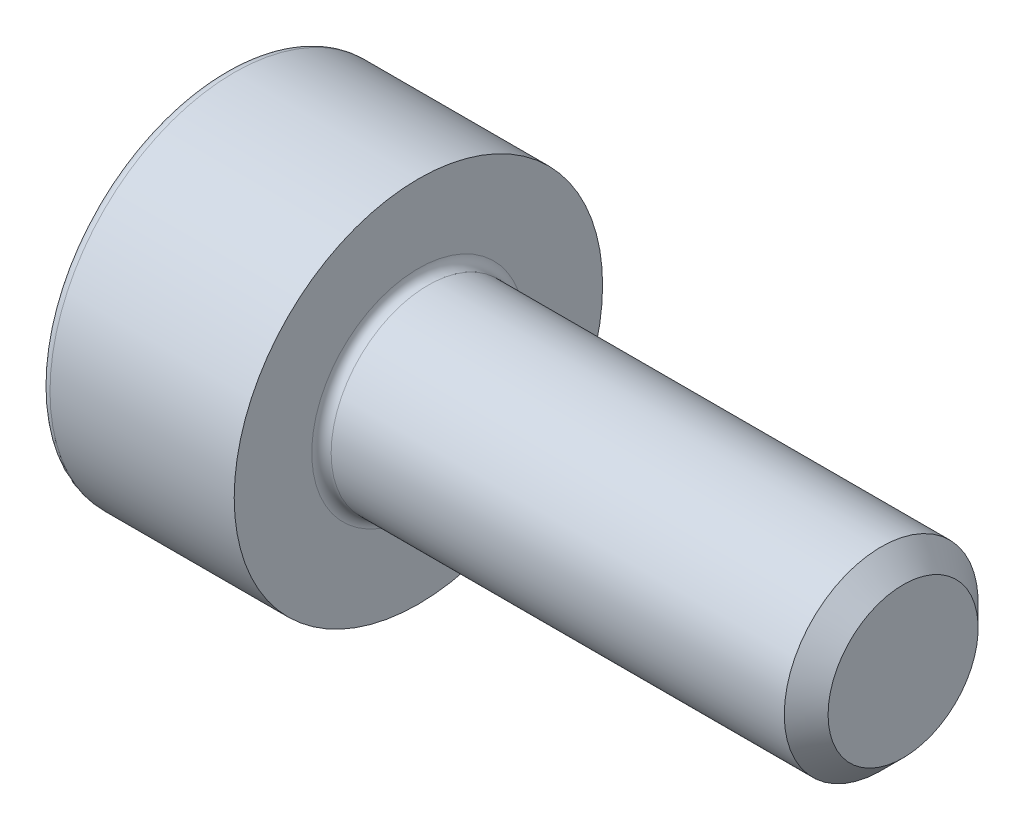
ISO-10303-21;
HEADER;
FILE_DESCRIPTION(('STEP AP214'),'2;1');
FILE_NAME('part.step','',(''),(''),'','','');
FILE_SCHEMA(('AUTOMOTIVE_DESIGN { 1 0 10303 214 1 1 1 1 }'));
ENDSEC;
DATA;
#1=APPLICATION_CONTEXT('core data for automotive mechanical design processes');
#2=APPLICATION_PROTOCOL_DEFINITION('international standard','automotive_design',2000,#1);
#3=PRODUCT_CONTEXT('',#1,'mechanical');
#4=PRODUCT('Part','Part','',(#3));
#5=PRODUCT_RELATED_PRODUCT_CATEGORY('part','',(#4));
#6=PRODUCT_DEFINITION_FORMATION('','',#4);
#7=PRODUCT_DEFINITION_CONTEXT('part definition',#1,'design');
#8=PRODUCT_DEFINITION('design','',#6,#7);
#9=PRODUCT_DEFINITION_SHAPE('','',#8);
#10=(LENGTH_UNIT() NAMED_UNIT(*) SI_UNIT(.MILLI.,.METRE.));
#11=(NAMED_UNIT(*) PLANE_ANGLE_UNIT() SI_UNIT($,.RADIAN.));
#12=(NAMED_UNIT(*) SI_UNIT($,.STERADIAN.) SOLID_ANGLE_UNIT());
#13=UNCERTAINTY_MEASURE_WITH_UNIT(LENGTH_MEASURE(1.E-05),#10,'distance_accuracy_value','');
#14=(GEOMETRIC_REPRESENTATION_CONTEXT(3) GLOBAL_UNCERTAINTY_ASSIGNED_CONTEXT((#13)) GLOBAL_UNIT_ASSIGNED_CONTEXT((#10,
#11,#12)) REPRESENTATION_CONTEXT('',''));
#15=CARTESIAN_POINT('',(0.,0.,0.));
#16=DIRECTION('',(0.,0.,1.));
#17=DIRECTION('',(1.,0.,0.));
#18=AXIS2_PLACEMENT_3D('',#15,#16,#17);
#19=CARTESIAN_POINT('',(0.,0.,0.));
#20=DIRECTION('',(-1.,0.,0.));
#21=DIRECTION('',(0.,0.,1.));
#22=AXIS2_PLACEMENT_3D('',#19,#20,#21);
#23=PLANE('',#22);
#24=DIRECTION('',(0.,-0.5,0.86602540378444));
#25=VECTOR('',#24,1.);
#26=CARTESIAN_POINT('',(0.,0.892006165897969,0.));
#27=LINE('',#26,#25);
#28=CARTESIAN_POINT('',(0.,0.892006165897969,0.));
#29=VERTEX_POINT('',#28);
#30=CARTESIAN_POINT('',(0.,0.446003082948984,0.7725));
#31=VERTEX_POINT('',#30);
#32=EDGE_CURVE('E253',#29,#31,#27,.T.);
#33=ORIENTED_EDGE('',*,*,#32,.T.);
#34=DIRECTION('',(0.,1.,0.));
#35=VECTOR('',#34,1.);
#36=CARTESIAN_POINT('',(0.,-0.446003082948988,0.7725));
#37=LINE('',#36,#35);
#38=CARTESIAN_POINT('',(0.,-0.446003082948988,0.7725));
#39=VERTEX_POINT('',#38);
#40=EDGE_CURVE('E108',#39,#31,#37,.T.);
#41=ORIENTED_EDGE('',*,*,#40,.F.);
#42=DIRECTION('',(0.,-0.5,-0.866025403784438));
#43=VECTOR('',#42,1.);
#44=CARTESIAN_POINT('',(0.,-0.446003082948988,0.7725));
#45=LINE('',#44,#43);
#46=CARTESIAN_POINT('',(0.,-0.892006165897974,0.));
#47=VERTEX_POINT('',#46);
#48=EDGE_CURVE('E256',#39,#47,#45,.T.);
#49=ORIENTED_EDGE('',*,*,#48,.T.);
#50=DIRECTION('',(0.,0.5,-0.86602540378444));
#51=VECTOR('',#50,1.);
#52=CARTESIAN_POINT('',(0.,-0.892006165897974,0.));
#53=LINE('',#52,#51);
#54=CARTESIAN_POINT('',(0.,-0.44600308294899,-0.7725));
#55=VERTEX_POINT('',#54);
#56=EDGE_CURVE('E259',#47,#55,#53,.T.);
#57=ORIENTED_EDGE('',*,*,#56,.T.);
#58=DIRECTION('',(0.,-1.,0.));
#59=VECTOR('',#58,1.);
#60=CARTESIAN_POINT('',(0.,0.446003082948982,-0.7725));
#61=LINE('',#60,#59);
#62=CARTESIAN_POINT('',(0.,0.446003082948982,-0.7725));
#63=VERTEX_POINT('',#62);
#64=EDGE_CURVE('E262',#63,#55,#61,.T.);
#65=ORIENTED_EDGE('',*,*,#64,.F.);
#66=DIRECTION('',(0.,-0.5,-0.866025403784438));
#67=VECTOR('',#66,1.);
#68=CARTESIAN_POINT('',(0.,0.892006165897969,0.));
#69=LINE('',#68,#67);
#70=EDGE_CURVE('E103',#29,#63,#69,.T.);
#71=ORIENTED_EDGE('',*,*,#70,.F.);
#72=EDGE_LOOP('',(#33,#41,#49,#57,#65,#71));
#73=FACE_BOUND('',#72,.T.);
#74=CARTESIAN_POINT('',(0.,0.,0.));
#75=DIRECTION('',(-1.,0.,0.));
#76=DIRECTION('',(0.,0.,1.));
#77=AXIS2_PLACEMENT_3D('',#74,#75,#76);
#78=CIRCLE('',#77,1.8);
#79=CARTESIAN_POINT('',(0.,0.,1.8));
#80=VERTEX_POINT('',#79);
#81=EDGE_CURVE('E24',#80,#80,#78,.T.);
#82=ORIENTED_EDGE('',*,*,#81,.T.);
#83=EDGE_LOOP('',(#82));
#84=FACE_BOUND('',#83,.T.);
#85=ADVANCED_FACE('F16',(#73,#84),#23,.T.);
#86=CARTESIAN_POINT('',(-31.75,0.,0.));
#87=DIRECTION('',(-1.,0.,0.));
#88=DIRECTION('',(0.,0.,1.));
#89=AXIS2_PLACEMENT_3D('',#86,#87,#88);
#90=CYLINDRICAL_SURFACE('',#89,1.9);
#91=CARTESIAN_POINT('',(0.100000000000003,0.,0.));
#92=DIRECTION('',(-1.,0.,0.));
#93=DIRECTION('',(0.,0.,1.));
#94=AXIS2_PLACEMENT_3D('',#91,#92,#93);
#95=CIRCLE('',#94,1.9);
#96=CARTESIAN_POINT('',(0.100000000000003,0.,1.9));
#97=VERTEX_POINT('',#96);
#98=EDGE_CURVE('E11',#97,#97,#95,.F.);
#99=ORIENTED_EDGE('',*,*,#98,.T.);
#100=EDGE_LOOP('',(#99));
#101=FACE_BOUND('',#100,.T.);
#102=CARTESIAN_POINT('',(2.,0.,0.));
#103=DIRECTION('',(-1.,0.,0.));
#104=DIRECTION('',(0.,0.,1.));
#105=AXIS2_PLACEMENT_3D('',#102,#103,#104);
#106=CIRCLE('',#105,1.9);
#107=CARTESIAN_POINT('',(2.,0.,1.9));
#108=VERTEX_POINT('',#107);
#109=EDGE_CURVE('E126',#108,#108,#106,.T.);
#110=ORIENTED_EDGE('',*,*,#109,.T.);
#111=EDGE_LOOP('',(#110));
#112=FACE_BOUND('',#111,.T.);
#113=ADVANCED_FACE('F152',(#101,#112),#90,.T.);
#114=CARTESIAN_POINT('',(2.,1.9,0.));
#115=DIRECTION('',(1.,0.,0.));
#116=DIRECTION('',(0.,0.,-1.));
#117=AXIS2_PLACEMENT_3D('',#114,#115,#116);
#118=PLANE('',#117);
#119=CARTESIAN_POINT('',(2.,0.,0.));
#120=DIRECTION('',(1.,0.,0.));
#121=DIRECTION('',(0.,0.,-1.));
#122=AXIS2_PLACEMENT_3D('',#119,#120,#121);
#123=CIRCLE('',#122,1.1);
#124=CARTESIAN_POINT('',(2.,0.,-1.1));
#125=VERTEX_POINT('',#124);
#126=EDGE_CURVE('E129',#125,#125,#123,.F.);
#127=ORIENTED_EDGE('',*,*,#126,.T.);
#128=EDGE_LOOP('',(#127));
#129=FACE_BOUND('',#128,.T.);
#130=ORIENTED_EDGE('',*,*,#109,.F.);
#131=EDGE_LOOP('',(#130));
#132=FACE_BOUND('',#131,.T.);
#133=ADVANCED_FACE('F159',(#129,#132),#118,.T.);
#134=CARTESIAN_POINT('',(-31.75,0.,0.));
#135=DIRECTION('',(-1.,0.,0.));
#136=DIRECTION('',(0.,0.,1.));
#137=AXIS2_PLACEMENT_3D('',#134,#135,#136);
#138=CYLINDRICAL_SURFACE('',#137,1.);
#139=CARTESIAN_POINT('',(2.1,0.,0.));
#140=DIRECTION('',(1.,0.,0.));
#141=DIRECTION('',(0.,0.,-1.));
#142=AXIS2_PLACEMENT_3D('',#139,#140,#141);
#143=CIRCLE('',#142,1.);
#144=CARTESIAN_POINT('',(2.1,0.,-1.));
#145=VERTEX_POINT('',#144);
#146=EDGE_CURVE('E132',#145,#145,#143,.T.);
#147=ORIENTED_EDGE('',*,*,#146,.T.);
#148=EDGE_LOOP('',(#147));
#149=FACE_BOUND('',#148,.T.);
#150=CARTESIAN_POINT('',(6.774,0.,0.));
#151=DIRECTION('',(-1.,0.,0.));
#152=DIRECTION('',(0.,0.,1.));
#153=AXIS2_PLACEMENT_3D('',#150,#151,#152);
#154=CIRCLE('',#153,1.);
#155=CARTESIAN_POINT('',(6.774,0.,1.));
#156=VERTEX_POINT('',#155);
#157=EDGE_CURVE('E123',#156,#156,#154,.T.);
#158=ORIENTED_EDGE('',*,*,#157,.T.);
#159=EDGE_LOOP('',(#158));
#160=FACE_BOUND('',#159,.T.);
#161=ADVANCED_FACE('F165',(#149,#160),#138,.T.);
#162=CARTESIAN_POINT('',(7.,0.,0.));
#163=DIRECTION('',(-1.,0.,0.));
#164=DIRECTION('',(0.,0.,1.));
#165=AXIS2_PLACEMENT_3D('',#162,#163,#164);
#166=CONICAL_SURFACE('',#165,0.774,0.785398163397475);
#167=ORIENTED_EDGE('',*,*,#157,.F.);
#168=EDGE_LOOP('',(#167));
#169=FACE_BOUND('',#168,.T.);
#170=CARTESIAN_POINT('',(7.,0.,0.));
#171=DIRECTION('',(-1.,0.,0.));
#172=DIRECTION('',(0.,0.,1.));
#173=AXIS2_PLACEMENT_3D('',#170,#171,#172);
#174=CIRCLE('',#173,0.774);
#175=CARTESIAN_POINT('',(7.,0.,0.774));
#176=VERTEX_POINT('',#175);
#177=EDGE_CURVE('E119',#176,#176,#174,.T.);
#178=ORIENTED_EDGE('',*,*,#177,.T.);
#179=EDGE_LOOP('',(#178));
#180=FACE_BOUND('',#179,.T.);
#181=ADVANCED_FACE('F169',(#169,#180),#166,.T.);
#182=CARTESIAN_POINT('',(7.,0.774,0.));
#183=DIRECTION('',(1.,0.,0.));
#184=DIRECTION('',(0.,0.,-1.));
#185=AXIS2_PLACEMENT_3D('',#182,#183,#184);
#186=PLANE('',#185);
#187=ORIENTED_EDGE('',*,*,#177,.F.);
#188=EDGE_LOOP('',(#187));
#189=FACE_BOUND('',#188,.T.);
#190=ADVANCED_FACE('F148',(#189),#186,.T.);
#191=CARTESIAN_POINT('',(2.1,0.,0.));
#192=DIRECTION('',(1.,0.,0.));
#193=DIRECTION('',(0.,0.,-1.));
#194=AXIS2_PLACEMENT_3D('',#191,#192,#193);
#195=TOROIDAL_SURFACE('',#194,1.1,0.1);
#196=ORIENTED_EDGE('',*,*,#146,.F.);
#197=EDGE_LOOP('',(#196));
#198=FACE_BOUND('',#197,.T.);
#199=ORIENTED_EDGE('',*,*,#126,.F.);
#200=EDGE_LOOP('',(#199));
#201=FACE_BOUND('',#200,.T.);
#202=ADVANCED_FACE('F139',(#198,#201),#195,.F.);
#203=CARTESIAN_POINT('',(0.100000000000003,0.,0.));
#204=DIRECTION('',(-1.,0.,0.));
#205=DIRECTION('',(0.,0.,1.));
#206=AXIS2_PLACEMENT_3D('',#203,#204,#205);
#207=TOROIDAL_SURFACE('',#206,1.8,0.1);
#208=ORIENTED_EDGE('',*,*,#98,.F.);
#209=EDGE_LOOP('',(#208));
#210=FACE_BOUND('',#209,.T.);
#211=ORIENTED_EDGE('',*,*,#81,.F.);
#212=EDGE_LOOP('',(#211));
#213=FACE_BOUND('',#212,.T.);
#214=ADVANCED_FACE('F18',(#210,#213),#207,.T.);
#215=CARTESIAN_POINT('',(1.,0.892006165897969,0.));
#216=DIRECTION('',(0.,-0.86602540378444,-0.5));
#217=DIRECTION('',(0.,0.5,-0.86602540378444));
#218=AXIS2_PLACEMENT_3D('',#215,#216,#217);
#219=PLANE('',#218);
#220=ORIENTED_EDGE('',*,*,#32,.F.);
#221=DIRECTION('',(-1.,0.,0.));
#222=VECTOR('',#221,1.);
#223=CARTESIAN_POINT('',(1.,0.892006165897969,0.));
#224=LINE('',#223,#222);
#225=CARTESIAN_POINT('',(1.,0.892006165897969,0.));
#226=VERTEX_POINT('',#225);
#227=EDGE_CURVE('E252',#226,#29,#224,.T.);
#228=ORIENTED_EDGE('',*,*,#227,.F.);
#229=DIRECTION('',(0.,-0.5,0.86602540378444));
#230=VECTOR('',#229,1.);
#231=CARTESIAN_POINT('',(1.,0.892006165897969,0.));
#232=LINE('',#231,#230);
#233=CARTESIAN_POINT('',(1.,0.66900462442348,0.38625));
#234=VERTEX_POINT('',#233);
#235=EDGE_CURVE('E31',#226,#234,#232,.T.);
#236=ORIENTED_EDGE('',*,*,#235,.T.);
#237=CARTESIAN_POINT('',(1.,0.446003082948984,0.7725));
#238=VERTEX_POINT('',#237);
#239=EDGE_CURVE('E89',#234,#238,#232,.T.);
#240=ORIENTED_EDGE('',*,*,#239,.T.);
#241=DIRECTION('',(-1.,0.,0.));
#242=VECTOR('',#241,1.);
#243=CARTESIAN_POINT('',(1.,0.446003082948984,0.7725));
#244=LINE('',#243,#242);
#245=EDGE_CURVE('E101',#238,#31,#244,.T.);
#246=ORIENTED_EDGE('',*,*,#245,.T.);
#247=EDGE_LOOP('',(#220,#228,#236,#240,#246));
#248=FACE_BOUND('',#247,.T.);
#249=ADVANCED_FACE('F100',(#248),#219,.T.);
#250=CARTESIAN_POINT('',(1.,-0.446003082948988,0.7725));
#251=DIRECTION('',(0.,0.,1.));
#252=DIRECTION('',(0.,-1.,0.));
#253=AXIS2_PLACEMENT_3D('',#250,#251,#252);
#254=PLANE('',#253);
#255=ORIENTED_EDGE('',*,*,#40,.T.);
#256=ORIENTED_EDGE('',*,*,#245,.F.);
#257=DIRECTION('',(0.,1.,0.));
#258=VECTOR('',#257,1.);
#259=CARTESIAN_POINT('',(1.,-0.446003082948988,0.7725));
#260=LINE('',#259,#258);
#261=CARTESIAN_POINT('',(1.,0.,0.7725));
#262=VERTEX_POINT('',#261);
#263=EDGE_CURVE('E87',#262,#238,#260,.T.);
#264=ORIENTED_EDGE('',*,*,#263,.F.);
#265=CARTESIAN_POINT('',(1.,-0.446003082948988,0.7725));
#266=VERTEX_POINT('',#265);
#267=EDGE_CURVE('E97',#266,#262,#260,.T.);
#268=ORIENTED_EDGE('',*,*,#267,.F.);
#269=DIRECTION('',(-1.,0.,0.));
#270=VECTOR('',#269,1.);
#271=CARTESIAN_POINT('',(1.,-0.446003082948988,0.7725));
#272=LINE('',#271,#270);
#273=EDGE_CURVE('E110',#266,#39,#272,.T.);
#274=ORIENTED_EDGE('',*,*,#273,.T.);
#275=EDGE_LOOP('',(#255,#256,#264,#268,#274));
#276=FACE_BOUND('',#275,.T.);
#277=ADVANCED_FACE('F105',(#276),#254,.F.);
#278=CARTESIAN_POINT('',(1.,-0.446003082948988,0.7725));
#279=DIRECTION('',(0.,0.866025403784438,-0.5));
#280=DIRECTION('',(0.,0.5,0.866025403784438));
#281=AXIS2_PLACEMENT_3D('',#278,#279,#280);
#282=PLANE('',#281);
#283=ORIENTED_EDGE('',*,*,#48,.F.);
#284=ORIENTED_EDGE('',*,*,#273,.F.);
#285=DIRECTION('',(0.,-0.5,-0.866025403784438));
#286=VECTOR('',#285,1.);
#287=CARTESIAN_POINT('',(1.,-0.446003082948988,0.7725));
#288=LINE('',#287,#286);
#289=CARTESIAN_POINT('',(1.,-0.669004624423479,0.38625));
#290=VERTEX_POINT('',#289);
#291=EDGE_CURVE('E233',#266,#290,#288,.T.);
#292=ORIENTED_EDGE('',*,*,#291,.T.);
#293=CARTESIAN_POINT('',(1.,-0.892006165897974,0.));
#294=VERTEX_POINT('',#293);
#295=EDGE_CURVE('E235',#290,#294,#288,.T.);
#296=ORIENTED_EDGE('',*,*,#295,.T.);
#297=DIRECTION('',(-1.,0.,0.));
#298=VECTOR('',#297,1.);
#299=CARTESIAN_POINT('',(1.,-0.892006165897974,0.));
#300=LINE('',#299,#298);
#301=EDGE_CURVE('E115',#294,#47,#300,.T.);
#302=ORIENTED_EDGE('',*,*,#301,.T.);
#303=EDGE_LOOP('',(#283,#284,#292,#296,#302));
#304=FACE_BOUND('',#303,.T.);
#305=ADVANCED_FACE('F182',(#304),#282,.T.);
#306=CARTESIAN_POINT('',(1.,-0.892006165897974,0.));
#307=DIRECTION('',(0.,0.86602540378444,0.5));
#308=DIRECTION('',(0.,-0.5,0.86602540378444));
#309=AXIS2_PLACEMENT_3D('',#306,#307,#308);
#310=PLANE('',#309);
#311=ORIENTED_EDGE('',*,*,#56,.F.);
#312=ORIENTED_EDGE('',*,*,#301,.F.);
#313=DIRECTION('',(0.,0.5,-0.86602540378444));
#314=VECTOR('',#313,1.);
#315=CARTESIAN_POINT('',(1.,-0.892006165897974,0.));
#316=LINE('',#315,#314);
#317=CARTESIAN_POINT('',(1.,-0.669004624423483,-0.38625));
#318=VERTEX_POINT('',#317);
#319=EDGE_CURVE('E238',#294,#318,#316,.T.);
#320=ORIENTED_EDGE('',*,*,#319,.T.);
#321=CARTESIAN_POINT('',(1.,-0.44600308294899,-0.7725));
#322=VERTEX_POINT('',#321);
#323=EDGE_CURVE('E242',#318,#322,#316,.T.);
#324=ORIENTED_EDGE('',*,*,#323,.T.);
#325=DIRECTION('',(-1.,0.,0.));
#326=VECTOR('',#325,1.);
#327=CARTESIAN_POINT('',(1.,-0.44600308294899,-0.7725));
#328=LINE('',#327,#326);
#329=EDGE_CURVE('E271',#322,#55,#328,.T.);
#330=ORIENTED_EDGE('',*,*,#329,.T.);
#331=EDGE_LOOP('',(#311,#312,#320,#324,#330));
#332=FACE_BOUND('',#331,.T.);
#333=ADVANCED_FACE('F185',(#332),#310,.T.);
#334=CARTESIAN_POINT('',(1.,0.446003082948982,-0.7725));
#335=DIRECTION('',(0.,0.,-1.));
#336=DIRECTION('',(0.,1.,0.));
#337=AXIS2_PLACEMENT_3D('',#334,#335,#336);
#338=PLANE('',#337);
#339=ORIENTED_EDGE('',*,*,#64,.T.);
#340=ORIENTED_EDGE('',*,*,#329,.F.);
#341=DIRECTION('',(0.,-1.,0.));
#342=VECTOR('',#341,1.);
#343=CARTESIAN_POINT('',(1.,0.446003082948982,-0.7725));
#344=LINE('',#343,#342);
#345=CARTESIAN_POINT('',(1.,0.,-0.7725));
#346=VERTEX_POINT('',#345);
#347=EDGE_CURVE('E246',#346,#322,#344,.T.);
#348=ORIENTED_EDGE('',*,*,#347,.F.);
#349=CARTESIAN_POINT('',(1.,0.446003082948982,-0.7725));
#350=VERTEX_POINT('',#349);
#351=EDGE_CURVE('E247',#350,#346,#344,.T.);
#352=ORIENTED_EDGE('',*,*,#351,.F.);
#353=DIRECTION('',(-1.,0.,0.));
#354=VECTOR('',#353,1.);
#355=CARTESIAN_POINT('',(1.,0.446003082948982,-0.7725));
#356=LINE('',#355,#354);
#357=EDGE_CURVE('E268',#350,#63,#356,.T.);
#358=ORIENTED_EDGE('',*,*,#357,.T.);
#359=EDGE_LOOP('',(#339,#340,#348,#352,#358));
#360=FACE_BOUND('',#359,.T.);
#361=ADVANCED_FACE('F189',(#360),#338,.F.);
#362=CARTESIAN_POINT('',(1.,0.892006165897969,0.));
#363=DIRECTION('',(0.,0.866025403784438,-0.5));
#364=DIRECTION('',(0.,0.5,0.866025403784438));
#365=AXIS2_PLACEMENT_3D('',#362,#363,#364);
#366=PLANE('',#365);
#367=ORIENTED_EDGE('',*,*,#70,.T.);
#368=ORIENTED_EDGE('',*,*,#357,.F.);
#369=DIRECTION('',(0.,-0.5,-0.866025403784438));
#370=VECTOR('',#369,1.);
#371=CARTESIAN_POINT('',(1.,0.892006165897969,0.));
#372=LINE('',#371,#370);
#373=CARTESIAN_POINT('',(1.,0.669004624423477,-0.38625));
#374=VERTEX_POINT('',#373);
#375=EDGE_CURVE('E250',#374,#350,#372,.T.);
#376=ORIENTED_EDGE('',*,*,#375,.F.);
#377=EDGE_CURVE('E224',#226,#374,#372,.T.);
#378=ORIENTED_EDGE('',*,*,#377,.F.);
#379=ORIENTED_EDGE('',*,*,#227,.T.);
#380=EDGE_LOOP('',(#367,#368,#376,#378,#379));
#381=FACE_BOUND('',#380,.T.);
#382=ADVANCED_FACE('F193',(#381),#366,.F.);
#383=CARTESIAN_POINT('',(1.,0.446003082948983,0.7725));
#384=DIRECTION('',(-1.,0.,0.));
#385=DIRECTION('',(0.,0.,1.));
#386=AXIS2_PLACEMENT_3D('',#383,#384,#385);
#387=PLANE('',#386);
#388=CARTESIAN_POINT('',(1.,0.,0.));
#389=DIRECTION('',(-1.,0.,0.));
#390=DIRECTION('',(0.,0.,1.));
#391=AXIS2_PLACEMENT_3D('',#388,#389,#390);
#392=CIRCLE('',#391,0.7725);
#393=EDGE_CURVE('E109',#290,#262,#392,.T.);
#394=ORIENTED_EDGE('',*,*,#393,.F.);
#395=ORIENTED_EDGE('',*,*,#291,.F.);
#396=ORIENTED_EDGE('',*,*,#267,.T.);
#397=EDGE_LOOP('',(#394,#395,#396));
#398=FACE_BOUND('',#397,.T.);
#399=ADVANCED_FACE('F197',(#398),#387,.T.);
#400=EDGE_CURVE('E113',#318,#290,#392,.T.);
#401=ORIENTED_EDGE('',*,*,#400,.F.);
#402=ORIENTED_EDGE('',*,*,#319,.F.);
#403=ORIENTED_EDGE('',*,*,#295,.F.);
#404=EDGE_LOOP('',(#401,#402,#403));
#405=FACE_BOUND('',#404,.T.);
#406=ADVANCED_FACE('F200',(#405),#387,.T.);
#407=EDGE_CURVE('E277',#346,#318,#392,.T.);
#408=ORIENTED_EDGE('',*,*,#407,.F.);
#409=ORIENTED_EDGE('',*,*,#347,.T.);
#410=ORIENTED_EDGE('',*,*,#323,.F.);
#411=EDGE_LOOP('',(#408,#409,#410));
#412=FACE_BOUND('',#411,.T.);
#413=ADVANCED_FACE('F206',(#412),#387,.T.);
#414=EDGE_CURVE('E227',#374,#346,#392,.T.);
#415=ORIENTED_EDGE('',*,*,#414,.F.);
#416=ORIENTED_EDGE('',*,*,#375,.T.);
#417=ORIENTED_EDGE('',*,*,#351,.T.);
#418=EDGE_LOOP('',(#415,#416,#417));
#419=FACE_BOUND('',#418,.T.);
#420=ADVANCED_FACE('F214',(#419),#387,.T.);
#421=EDGE_CURVE('E120',#234,#374,#392,.T.);
#422=ORIENTED_EDGE('',*,*,#421,.F.);
#423=ORIENTED_EDGE('',*,*,#235,.F.);
#424=ORIENTED_EDGE('',*,*,#377,.T.);
#425=EDGE_LOOP('',(#422,#423,#424));
#426=FACE_BOUND('',#425,.T.);
#427=ADVANCED_FACE('F209',(#426),#387,.T.);
#428=EDGE_CURVE('E92',#262,#234,#392,.T.);
#429=ORIENTED_EDGE('',*,*,#428,.F.);
#430=ORIENTED_EDGE('',*,*,#263,.T.);
#431=ORIENTED_EDGE('',*,*,#239,.F.);
#432=EDGE_LOOP('',(#429,#430,#431));
#433=FACE_BOUND('',#432,.T.);
#434=ADVANCED_FACE('F88',(#433),#387,.T.);
#435=CARTESIAN_POINT('',(1.,0.,0.));
#436=DIRECTION('',(-1.,0.,0.));
#437=DIRECTION('',(0.,0.,1.));
#438=AXIS2_PLACEMENT_3D('',#435,#436,#437);
#439=CONICAL_SURFACE('',#438,0.7725,1.04719755119659);
#440=CARTESIAN_POINT('',(1.446003082949,0.,0.));
#441=VERTEX_POINT('',#440);
#442=VERTEX_LOOP('',#441);
#443=FACE_BOUND('',#442,.T.);
#444=ORIENTED_EDGE('',*,*,#428,.T.);
#445=ORIENTED_EDGE('',*,*,#421,.T.);
#446=ORIENTED_EDGE('',*,*,#414,.T.);
#447=ORIENTED_EDGE('',*,*,#407,.T.);
#448=ORIENTED_EDGE('',*,*,#400,.T.);
#449=ORIENTED_EDGE('',*,*,#393,.T.);
#450=EDGE_LOOP('',(#444,#445,#446,#447,#448,#449));
#451=FACE_BOUND('',#450,.T.);
#452=ADVANCED_FACE('F177',(#443,#451),#439,.F.);
#453=CLOSED_SHELL('',(#85,#113,#133,#161,#181,#190,#202,#214,#249,#277,#305,#333,#361,#382,#399,
#406,#413,#420,#427,#434,#452));
#454=MANIFOLD_SOLID_BREP('B1',#453);
#455=ADVANCED_BREP_SHAPE_REPRESENTATION('',(#18,#454),#14);
#456=SHAPE_DEFINITION_REPRESENTATION(#9,#455);
ENDSEC;
END-ISO-10303-21;
